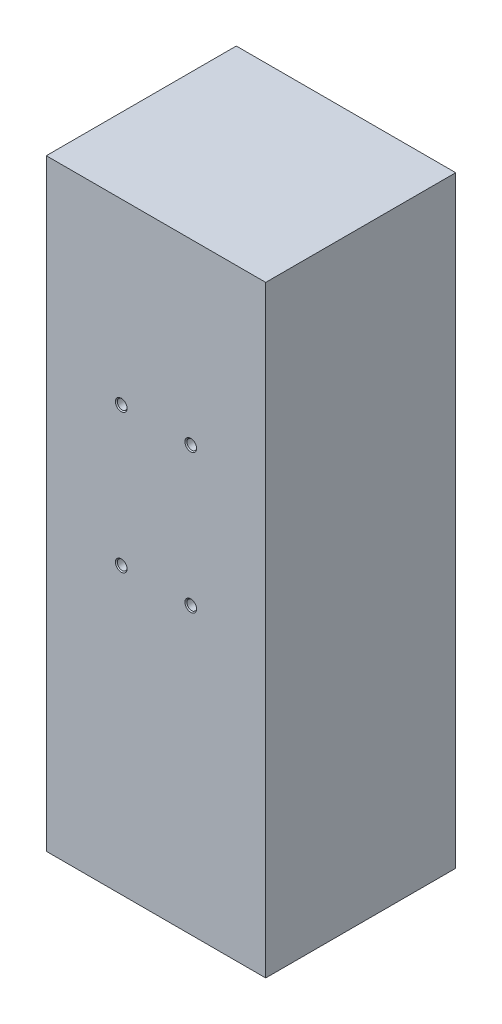
ISO-10303-21;
HEADER;
FILE_DESCRIPTION(('STEP AP214'),'2;1');
FILE_NAME('part.step','',(''),(''),'','','');
FILE_SCHEMA(('AUTOMOTIVE_DESIGN { 1 0 10303 214 1 1 1 1 }'));
ENDSEC;
DATA;
#1=APPLICATION_CONTEXT('core data for automotive mechanical design processes');
#2=APPLICATION_PROTOCOL_DEFINITION('international standard','automotive_design',2000,#1);
#3=PRODUCT_CONTEXT('',#1,'mechanical');
#4=PRODUCT('Part','Part','',(#3));
#5=PRODUCT_RELATED_PRODUCT_CATEGORY('part','',(#4));
#6=PRODUCT_DEFINITION_FORMATION('','',#4);
#7=PRODUCT_DEFINITION_CONTEXT('part definition',#1,'design');
#8=PRODUCT_DEFINITION('design','',#6,#7);
#9=PRODUCT_DEFINITION_SHAPE('','',#8);
#10=(LENGTH_UNIT() NAMED_UNIT(*) SI_UNIT(.MILLI.,.METRE.));
#11=(NAMED_UNIT(*) PLANE_ANGLE_UNIT() SI_UNIT($,.RADIAN.));
#12=(NAMED_UNIT(*) SI_UNIT($,.STERADIAN.) SOLID_ANGLE_UNIT());
#13=UNCERTAINTY_MEASURE_WITH_UNIT(LENGTH_MEASURE(1.E-05),#10,'distance_accuracy_value','');
#14=(GEOMETRIC_REPRESENTATION_CONTEXT(3) GLOBAL_UNCERTAINTY_ASSIGNED_CONTEXT((#13)) GLOBAL_UNIT_ASSIGNED_CONTEXT((#10,
#11,#12)) REPRESENTATION_CONTEXT('',''));
#15=CARTESIAN_POINT('',(0.,0.,0.));
#16=DIRECTION('',(0.,0.,1.));
#17=DIRECTION('',(1.,0.,0.));
#18=AXIS2_PLACEMENT_3D('',#15,#16,#17);
#19=CARTESIAN_POINT('',(47.35,130.,41.));
#20=DIRECTION('',(-1.,0.,0.));
#21=DIRECTION('',(0.,0.,1.));
#22=AXIS2_PLACEMENT_3D('',#19,#20,#21);
#23=PLANE('',#22);
#24=DIRECTION('',(0.,0.,-1.));
#25=VECTOR('',#24,1.);
#26=CARTESIAN_POINT('',(47.35,-130.,41.));
#27=LINE('',#26,#25);
#28=CARTESIAN_POINT('',(47.35,-130.,41.));
#29=VERTEX_POINT('',#28);
#30=CARTESIAN_POINT('',(47.35,-130.,-41.));
#31=VERTEX_POINT('',#30);
#32=EDGE_CURVE('E137',#29,#31,#27,.T.);
#33=ORIENTED_EDGE('',*,*,#32,.T.);
#34=DIRECTION('',(0.,-1.,0.));
#35=VECTOR('',#34,1.);
#36=CARTESIAN_POINT('',(47.35,130.,-41.));
#37=LINE('',#36,#35);
#38=CARTESIAN_POINT('',(47.35,130.,-41.));
#39=VERTEX_POINT('',#38);
#40=EDGE_CURVE('E11',#39,#31,#37,.T.);
#41=ORIENTED_EDGE('',*,*,#40,.F.);
#42=DIRECTION('',(0.,0.,-1.));
#43=VECTOR('',#42,1.);
#44=CARTESIAN_POINT('',(47.35,130.,41.));
#45=LINE('',#44,#43);
#46=CARTESIAN_POINT('',(47.35,130.,41.));
#47=VERTEX_POINT('',#46);
#48=EDGE_CURVE('E138',#47,#39,#45,.T.);
#49=ORIENTED_EDGE('',*,*,#48,.F.);
#50=DIRECTION('',(0.,-1.,0.));
#51=VECTOR('',#50,1.);
#52=CARTESIAN_POINT('',(47.35,130.,41.));
#53=LINE('',#52,#51);
#54=EDGE_CURVE('E144',#47,#29,#53,.T.);
#55=ORIENTED_EDGE('',*,*,#54,.T.);
#56=EDGE_LOOP('',(#33,#41,#49,#55));
#57=FACE_BOUND('',#56,.T.);
#58=ADVANCED_FACE('F33',(#57),#23,.F.);
#59=CARTESIAN_POINT('',(-47.35,130.,-41.));
#60=DIRECTION('',(0.,0.,1.));
#61=DIRECTION('',(1.,0.,0.));
#62=AXIS2_PLACEMENT_3D('',#59,#60,#61);
#63=PLANE('',#62);
#64=DIRECTION('',(-1.,0.,0.));
#65=VECTOR('',#64,1.);
#66=CARTESIAN_POINT('',(-47.35,-130.,-41.));
#67=LINE('',#66,#65);
#68=CARTESIAN_POINT('',(-47.35,-130.,-41.));
#69=VERTEX_POINT('',#68);
#70=EDGE_CURVE('E147',#31,#69,#67,.T.);
#71=ORIENTED_EDGE('',*,*,#70,.T.);
#72=DIRECTION('',(0.,-1.,0.));
#73=VECTOR('',#72,1.);
#74=CARTESIAN_POINT('',(-47.35,130.,-41.));
#75=LINE('',#74,#73);
#76=CARTESIAN_POINT('',(-47.35,130.,-41.));
#77=VERTEX_POINT('',#76);
#78=EDGE_CURVE('E41',#77,#69,#75,.T.);
#79=ORIENTED_EDGE('',*,*,#78,.F.);
#80=DIRECTION('',(-1.,0.,0.));
#81=VECTOR('',#80,1.);
#82=CARTESIAN_POINT('',(-47.35,130.,-41.));
#83=LINE('',#82,#81);
#84=EDGE_CURVE('E80',#39,#77,#83,.T.);
#85=ORIENTED_EDGE('',*,*,#84,.F.);
#86=ORIENTED_EDGE('',*,*,#40,.T.);
#87=EDGE_LOOP('',(#71,#79,#85,#86));
#88=FACE_BOUND('',#87,.T.);
#89=ADVANCED_FACE('F171',(#88),#63,.F.);
#90=CARTESIAN_POINT('',(-47.35,130.,41.));
#91=DIRECTION('',(1.,0.,0.));
#92=DIRECTION('',(0.,0.,-1.));
#93=AXIS2_PLACEMENT_3D('',#90,#91,#92);
#94=PLANE('',#93);
#95=DIRECTION('',(0.,0.,1.));
#96=VECTOR('',#95,1.);
#97=CARTESIAN_POINT('',(-47.35,-130.,41.));
#98=LINE('',#97,#96);
#99=CARTESIAN_POINT('',(-47.35,-130.,41.));
#100=VERTEX_POINT('',#99);
#101=EDGE_CURVE('E67',#69,#100,#98,.T.);
#102=ORIENTED_EDGE('',*,*,#101,.T.);
#103=DIRECTION('',(0.,-1.,0.));
#104=VECTOR('',#103,1.);
#105=CARTESIAN_POINT('',(-47.35,130.,41.));
#106=LINE('',#105,#104);
#107=CARTESIAN_POINT('',(-47.35,130.,41.));
#108=VERTEX_POINT('',#107);
#109=EDGE_CURVE('E152',#108,#100,#106,.T.);
#110=ORIENTED_EDGE('',*,*,#109,.F.);
#111=DIRECTION('',(0.,0.,1.));
#112=VECTOR('',#111,1.);
#113=CARTESIAN_POINT('',(-47.35,130.,41.));
#114=LINE('',#113,#112);
#115=EDGE_CURVE('E141',#77,#108,#114,.T.);
#116=ORIENTED_EDGE('',*,*,#115,.F.);
#117=ORIENTED_EDGE('',*,*,#78,.T.);
#118=EDGE_LOOP('',(#102,#110,#116,#117));
#119=FACE_BOUND('',#118,.T.);
#120=ADVANCED_FACE('F154',(#119),#94,.F.);
#121=CARTESIAN_POINT('',(-47.35,130.,41.));
#122=DIRECTION('',(0.,0.,-1.));
#123=DIRECTION('',(-1.,0.,0.));
#124=AXIS2_PLACEMENT_3D('',#121,#122,#123);
#125=PLANE('',#124);
#126=CARTESIAN_POINT('',(15.,53.,41.));
#127=DIRECTION('',(0.,0.,1.));
#128=DIRECTION('',(1.,0.,0.));
#129=AXIS2_PLACEMENT_3D('',#126,#127,#128);
#130=CIRCLE('',#129,2.525);
#131=CARTESIAN_POINT('',(17.525,53.,41.));
#132=VERTEX_POINT('',#131);
#133=EDGE_CURVE('E110',#132,#132,#130,.T.);
#134=ORIENTED_EDGE('',*,*,#133,.F.);
#135=EDGE_LOOP('',(#134));
#136=FACE_BOUND('',#135,.T.);
#137=CARTESIAN_POINT('',(-15.,53.,41.));
#138=DIRECTION('',(0.,0.,1.));
#139=DIRECTION('',(1.,0.,0.));
#140=AXIS2_PLACEMENT_3D('',#137,#138,#139);
#141=CIRCLE('',#140,2.525);
#142=CARTESIAN_POINT('',(-12.475,53.,41.));
#143=VERTEX_POINT('',#142);
#144=EDGE_CURVE('E103',#143,#143,#141,.T.);
#145=ORIENTED_EDGE('',*,*,#144,.F.);
#146=EDGE_LOOP('',(#145));
#147=FACE_BOUND('',#146,.T.);
#148=CARTESIAN_POINT('',(-15.,-7.00000000000001,41.));
#149=DIRECTION('',(0.,0.,1.));
#150=DIRECTION('',(1.,0.,0.));
#151=AXIS2_PLACEMENT_3D('',#148,#149,#150);
#152=CIRCLE('',#151,2.525);
#153=CARTESIAN_POINT('',(-12.475,-7.00000000000001,41.));
#154=VERTEX_POINT('',#153);
#155=EDGE_CURVE('E119',#154,#154,#152,.T.);
#156=ORIENTED_EDGE('',*,*,#155,.F.);
#157=EDGE_LOOP('',(#156));
#158=FACE_BOUND('',#157,.T.);
#159=CARTESIAN_POINT('',(15.,-7.,41.));
#160=DIRECTION('',(0.,0.,1.));
#161=DIRECTION('',(1.,0.,0.));
#162=AXIS2_PLACEMENT_3D('',#159,#160,#161);
#163=CIRCLE('',#162,2.525);
#164=CARTESIAN_POINT('',(17.525,-7.,41.));
#165=VERTEX_POINT('',#164);
#166=EDGE_CURVE('E128',#165,#165,#163,.T.);
#167=ORIENTED_EDGE('',*,*,#166,.F.);
#168=EDGE_LOOP('',(#167));
#169=FACE_BOUND('',#168,.T.);
#170=DIRECTION('',(1.,0.,0.));
#171=VECTOR('',#170,1.);
#172=CARTESIAN_POINT('',(-47.35,-130.,41.));
#173=LINE('',#172,#171);
#174=EDGE_CURVE('E73',#100,#29,#173,.T.);
#175=ORIENTED_EDGE('',*,*,#174,.T.);
#176=ORIENTED_EDGE('',*,*,#54,.F.);
#177=DIRECTION('',(1.,0.,0.));
#178=VECTOR('',#177,1.);
#179=CARTESIAN_POINT('',(-47.35,130.,41.));
#180=LINE('',#179,#178);
#181=EDGE_CURVE('E49',#108,#47,#180,.T.);
#182=ORIENTED_EDGE('',*,*,#181,.F.);
#183=ORIENTED_EDGE('',*,*,#109,.T.);
#184=EDGE_LOOP('',(#175,#176,#182,#183));
#185=FACE_BOUND('',#184,.T.);
#186=ADVANCED_FACE('F161',(#136,#147,#158,#169,#185),#125,.F.);
#187=CARTESIAN_POINT('',(0.,130.,0.));
#188=DIRECTION('',(0.,-1.,0.));
#189=DIRECTION('',(0.,0.,-1.));
#190=AXIS2_PLACEMENT_3D('',#187,#188,#189);
#191=PLANE('',#190);
#192=ORIENTED_EDGE('',*,*,#48,.T.);
#193=ORIENTED_EDGE('',*,*,#84,.T.);
#194=ORIENTED_EDGE('',*,*,#115,.T.);
#195=ORIENTED_EDGE('',*,*,#181,.T.);
#196=EDGE_LOOP('',(#192,#193,#194,#195));
#197=FACE_BOUND('',#196,.T.);
#198=ADVANCED_FACE('F163',(#197),#191,.F.);
#199=CARTESIAN_POINT('',(0.,-130.,0.));
#200=DIRECTION('',(0.,-1.,0.));
#201=DIRECTION('',(0.,0.,-1.));
#202=AXIS2_PLACEMENT_3D('',#199,#200,#201);
#203=PLANE('',#202);
#204=ORIENTED_EDGE('',*,*,#32,.F.);
#205=ORIENTED_EDGE('',*,*,#174,.F.);
#206=ORIENTED_EDGE('',*,*,#101,.F.);
#207=ORIENTED_EDGE('',*,*,#70,.F.);
#208=EDGE_LOOP('',(#204,#205,#206,#207));
#209=FACE_BOUND('',#208,.T.);
#210=ADVANCED_FACE('F157',(#209),#203,.T.);
#211=CARTESIAN_POINT('',(15.,-7.,28.6));
#212=DIRECTION('',(0.,0.,1.));
#213=DIRECTION('',(1.,0.,0.));
#214=AXIS2_PLACEMENT_3D('',#211,#212,#213);
#215=CONICAL_SURFACE('',#214,2.1,1.02974425867665);
#216=CARTESIAN_POINT('',(15.,-7.,27.3381927000421));
#217=VERTEX_POINT('',#216);
#218=VERTEX_LOOP('',#217);
#219=FACE_BOUND('',#218,.T.);
#220=CARTESIAN_POINT('',(15.,-7.,28.6));
#221=DIRECTION('',(0.,0.,1.));
#222=DIRECTION('',(1.,0.,0.));
#223=AXIS2_PLACEMENT_3D('',#220,#221,#222);
#224=CIRCLE('',#223,2.1);
#225=CARTESIAN_POINT('',(17.1,-7.,28.6));
#226=VERTEX_POINT('',#225);
#227=EDGE_CURVE('E134',#226,#226,#224,.T.);
#228=ORIENTED_EDGE('',*,*,#227,.T.);
#229=EDGE_LOOP('',(#228));
#230=FACE_BOUND('',#229,.T.);
#231=ADVANCED_FACE('F201',(#219,#230),#215,.F.);
#232=CARTESIAN_POINT('',(15.,-7.,41.));
#233=DIRECTION('',(0.,0.,1.));
#234=DIRECTION('',(1.,0.,0.));
#235=AXIS2_PLACEMENT_3D('',#232,#233,#234);
#236=CYLINDRICAL_SURFACE('',#235,2.1);
#237=ORIENTED_EDGE('',*,*,#227,.F.);
#238=EDGE_LOOP('',(#237));
#239=FACE_BOUND('',#238,.T.);
#240=CARTESIAN_POINT('',(15.,-7.,40.575));
#241=DIRECTION('',(0.,0.,1.));
#242=DIRECTION('',(1.,0.,0.));
#243=AXIS2_PLACEMENT_3D('',#240,#241,#242);
#244=CIRCLE('',#243,2.1);
#245=CARTESIAN_POINT('',(17.1,-7.,40.575));
#246=VERTEX_POINT('',#245);
#247=EDGE_CURVE('E131',#246,#246,#244,.T.);
#248=ORIENTED_EDGE('',*,*,#247,.T.);
#249=EDGE_LOOP('',(#248));
#250=FACE_BOUND('',#249,.T.);
#251=ADVANCED_FACE('F213',(#239,#250),#236,.F.);
#252=CARTESIAN_POINT('',(15.,-7.,41.));
#253=DIRECTION('',(0.,0.,1.));
#254=DIRECTION('',(1.,0.,0.));
#255=AXIS2_PLACEMENT_3D('',#252,#253,#254);
#256=CONICAL_SURFACE('',#255,2.525,0.785398163397448);
#257=ORIENTED_EDGE('',*,*,#247,.F.);
#258=EDGE_LOOP('',(#257));
#259=FACE_BOUND('',#258,.T.);
#260=ORIENTED_EDGE('',*,*,#166,.T.);
#261=EDGE_LOOP('',(#260));
#262=FACE_BOUND('',#261,.T.);
#263=ADVANCED_FACE('F223',(#259,#262),#256,.F.);
#264=CARTESIAN_POINT('',(-15.,-7.00000000000001,28.6));
#265=DIRECTION('',(0.,0.,1.));
#266=DIRECTION('',(1.,0.,0.));
#267=AXIS2_PLACEMENT_3D('',#264,#265,#266);
#268=CONICAL_SURFACE('',#267,2.1,1.02974425867665);
#269=CARTESIAN_POINT('',(-15.,-7.00000000000001,27.3381927000421));
#270=VERTEX_POINT('',#269);
#271=VERTEX_LOOP('',#270);
#272=FACE_BOUND('',#271,.T.);
#273=CARTESIAN_POINT('',(-15.,-7.00000000000001,28.6));
#274=DIRECTION('',(0.,0.,1.));
#275=DIRECTION('',(1.,0.,0.));
#276=AXIS2_PLACEMENT_3D('',#273,#274,#275);
#277=CIRCLE('',#276,2.1);
#278=CARTESIAN_POINT('',(-12.9,-7.00000000000001,28.6));
#279=VERTEX_POINT('',#278);
#280=EDGE_CURVE('E125',#279,#279,#277,.T.);
#281=ORIENTED_EDGE('',*,*,#280,.T.);
#282=EDGE_LOOP('',(#281));
#283=FACE_BOUND('',#282,.T.);
#284=ADVANCED_FACE('F233',(#272,#283),#268,.F.);
#285=CARTESIAN_POINT('',(-15.,-7.00000000000001,41.));
#286=DIRECTION('',(0.,0.,1.));
#287=DIRECTION('',(1.,0.,0.));
#288=AXIS2_PLACEMENT_3D('',#285,#286,#287);
#289=CYLINDRICAL_SURFACE('',#288,2.1);
#290=ORIENTED_EDGE('',*,*,#280,.F.);
#291=EDGE_LOOP('',(#290));
#292=FACE_BOUND('',#291,.T.);
#293=CARTESIAN_POINT('',(-15.,-7.00000000000001,40.575));
#294=DIRECTION('',(0.,0.,1.));
#295=DIRECTION('',(1.,0.,0.));
#296=AXIS2_PLACEMENT_3D('',#293,#294,#295);
#297=CIRCLE('',#296,2.1);
#298=CARTESIAN_POINT('',(-12.9,-7.00000000000001,40.575));
#299=VERTEX_POINT('',#298);
#300=EDGE_CURVE('E122',#299,#299,#297,.T.);
#301=ORIENTED_EDGE('',*,*,#300,.T.);
#302=EDGE_LOOP('',(#301));
#303=FACE_BOUND('',#302,.T.);
#304=ADVANCED_FACE('F243',(#292,#303),#289,.F.);
#305=CARTESIAN_POINT('',(-15.,-7.00000000000001,41.));
#306=DIRECTION('',(0.,0.,1.));
#307=DIRECTION('',(1.,0.,0.));
#308=AXIS2_PLACEMENT_3D('',#305,#306,#307);
#309=CONICAL_SURFACE('',#308,2.525,0.785398163397448);
#310=ORIENTED_EDGE('',*,*,#300,.F.);
#311=EDGE_LOOP('',(#310));
#312=FACE_BOUND('',#311,.T.);
#313=ORIENTED_EDGE('',*,*,#155,.T.);
#314=EDGE_LOOP('',(#313));
#315=FACE_BOUND('',#314,.T.);
#316=ADVANCED_FACE('F253',(#312,#315),#309,.F.);
#317=CARTESIAN_POINT('',(-15.,53.,28.6));
#318=DIRECTION('',(0.,0.,1.));
#319=DIRECTION('',(1.,0.,0.));
#320=AXIS2_PLACEMENT_3D('',#317,#318,#319);
#321=CONICAL_SURFACE('',#320,2.1,1.02974425867665);
#322=CARTESIAN_POINT('',(-15.,53.,27.3381927000421));
#323=VERTEX_POINT('',#322);
#324=VERTEX_LOOP('',#323);
#325=FACE_BOUND('',#324,.T.);
#326=CARTESIAN_POINT('',(-15.,53.,28.6));
#327=DIRECTION('',(0.,0.,1.));
#328=DIRECTION('',(1.,0.,0.));
#329=AXIS2_PLACEMENT_3D('',#326,#327,#328);
#330=CIRCLE('',#329,2.1);
#331=CARTESIAN_POINT('',(-12.9,53.,28.6));
#332=VERTEX_POINT('',#331);
#333=EDGE_CURVE('E116',#332,#332,#330,.T.);
#334=ORIENTED_EDGE('',*,*,#333,.T.);
#335=EDGE_LOOP('',(#334));
#336=FACE_BOUND('',#335,.T.);
#337=ADVANCED_FACE('F263',(#325,#336),#321,.F.);
#338=CARTESIAN_POINT('',(-15.,53.,41.));
#339=DIRECTION('',(0.,0.,1.));
#340=DIRECTION('',(1.,0.,0.));
#341=AXIS2_PLACEMENT_3D('',#338,#339,#340);
#342=CYLINDRICAL_SURFACE('',#341,2.1);
#343=ORIENTED_EDGE('',*,*,#333,.F.);
#344=EDGE_LOOP('',(#343));
#345=FACE_BOUND('',#344,.T.);
#346=CARTESIAN_POINT('',(-15.,53.,40.575));
#347=DIRECTION('',(0.,0.,1.));
#348=DIRECTION('',(1.,0.,0.));
#349=AXIS2_PLACEMENT_3D('',#346,#347,#348);
#350=CIRCLE('',#349,2.1);
#351=CARTESIAN_POINT('',(-12.9,53.,40.575));
#352=VERTEX_POINT('',#351);
#353=EDGE_CURVE('E107',#352,#352,#350,.T.);
#354=ORIENTED_EDGE('',*,*,#353,.T.);
#355=EDGE_LOOP('',(#354));
#356=FACE_BOUND('',#355,.T.);
#357=ADVANCED_FACE('F273',(#345,#356),#342,.F.);
#358=CARTESIAN_POINT('',(-15.,53.,41.));
#359=DIRECTION('',(0.,0.,1.));
#360=DIRECTION('',(1.,0.,0.));
#361=AXIS2_PLACEMENT_3D('',#358,#359,#360);
#362=CONICAL_SURFACE('',#361,2.525,0.785398163397448);
#363=ORIENTED_EDGE('',*,*,#353,.F.);
#364=EDGE_LOOP('',(#363));
#365=FACE_BOUND('',#364,.T.);
#366=ORIENTED_EDGE('',*,*,#144,.T.);
#367=EDGE_LOOP('',(#366));
#368=FACE_BOUND('',#367,.T.);
#369=ADVANCED_FACE('F97',(#365,#368),#362,.F.);
#370=CARTESIAN_POINT('',(15.,53.,28.6));
#371=DIRECTION('',(0.,0.,1.));
#372=DIRECTION('',(1.,0.,0.));
#373=AXIS2_PLACEMENT_3D('',#370,#371,#372);
#374=CONICAL_SURFACE('',#373,2.1,1.02974425867665);
#375=CARTESIAN_POINT('',(15.,53.,27.3381927000421));
#376=VERTEX_POINT('',#375);
#377=VERTEX_LOOP('',#376);
#378=FACE_BOUND('',#377,.T.);
#379=CARTESIAN_POINT('',(15.,53.,28.6));
#380=DIRECTION('',(0.,0.,1.));
#381=DIRECTION('',(1.,0.,0.));
#382=AXIS2_PLACEMENT_3D('',#379,#380,#381);
#383=CIRCLE('',#382,2.1);
#384=CARTESIAN_POINT('',(17.1,53.,28.6));
#385=VERTEX_POINT('',#384);
#386=EDGE_CURVE('E101',#385,#385,#383,.T.);
#387=ORIENTED_EDGE('',*,*,#386,.T.);
#388=EDGE_LOOP('',(#387));
#389=FACE_BOUND('',#388,.T.);
#390=ADVANCED_FACE('F93',(#378,#389),#374,.F.);
#391=CARTESIAN_POINT('',(15.,53.,41.));
#392=DIRECTION('',(0.,0.,1.));
#393=DIRECTION('',(1.,0.,0.));
#394=AXIS2_PLACEMENT_3D('',#391,#392,#393);
#395=CYLINDRICAL_SURFACE('',#394,2.1);
#396=ORIENTED_EDGE('',*,*,#386,.F.);
#397=EDGE_LOOP('',(#396));
#398=FACE_BOUND('',#397,.T.);
#399=CARTESIAN_POINT('',(15.,53.,40.575));
#400=DIRECTION('',(0.,0.,1.));
#401=DIRECTION('',(1.,0.,0.));
#402=AXIS2_PLACEMENT_3D('',#399,#400,#401);
#403=CIRCLE('',#402,2.1);
#404=CARTESIAN_POINT('',(17.1,53.,40.575));
#405=VERTEX_POINT('',#404);
#406=EDGE_CURVE('E104',#405,#405,#403,.T.);
#407=ORIENTED_EDGE('',*,*,#406,.T.);
#408=EDGE_LOOP('',(#407));
#409=FACE_BOUND('',#408,.T.);
#410=ADVANCED_FACE('F96',(#398,#409),#395,.F.);
#411=CARTESIAN_POINT('',(15.,53.,41.));
#412=DIRECTION('',(0.,0.,1.));
#413=DIRECTION('',(1.,0.,0.));
#414=AXIS2_PLACEMENT_3D('',#411,#412,#413);
#415=CONICAL_SURFACE('',#414,2.525,0.785398163397448);
#416=ORIENTED_EDGE('',*,*,#406,.F.);
#417=EDGE_LOOP('',(#416));
#418=FACE_BOUND('',#417,.T.);
#419=ORIENTED_EDGE('',*,*,#133,.T.);
#420=EDGE_LOOP('',(#419));
#421=FACE_BOUND('',#420,.T.);
#422=ADVANCED_FACE('F307',(#418,#421),#415,.F.);
#423=CLOSED_SHELL('',(#58,#89,#120,#186,#198,#210,#231,#251,#263,#284,#304,#316,#337,#357,#369,
#390,#410,#422));
#424=MANIFOLD_SOLID_BREP('B2',#423);
#425=ADVANCED_BREP_SHAPE_REPRESENTATION('',(#18,#424),#14);
#426=SHAPE_DEFINITION_REPRESENTATION(#9,#425);
ENDSEC;
END-ISO-10303-21;
